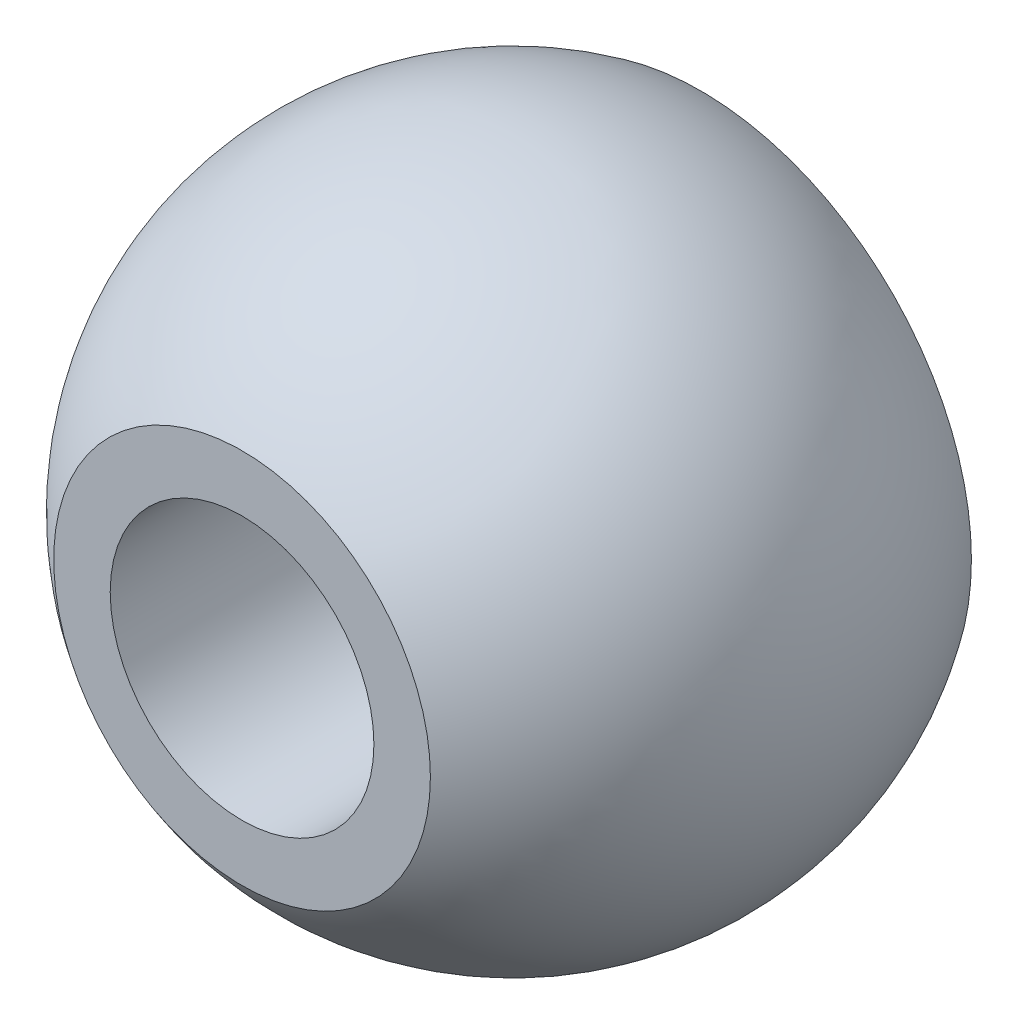
ISO-10303-21;
HEADER;
FILE_DESCRIPTION(('STEP AP214'),'2;1');
FILE_NAME('part.step','',(''),(''),'','','');
FILE_SCHEMA(('AUTOMOTIVE_DESIGN { 1 0 10303 214 1 1 1 1 }'));
ENDSEC;
DATA;
#1=APPLICATION_CONTEXT('core data for automotive mechanical design processes');
#2=APPLICATION_PROTOCOL_DEFINITION('international standard','automotive_design',2000,#1);
#3=PRODUCT_CONTEXT('',#1,'mechanical');
#4=PRODUCT('Part','Part','',(#3));
#5=PRODUCT_RELATED_PRODUCT_CATEGORY('part','',(#4));
#6=PRODUCT_DEFINITION_FORMATION('','',#4);
#7=PRODUCT_DEFINITION_CONTEXT('part definition',#1,'design');
#8=PRODUCT_DEFINITION('design','',#6,#7);
#9=PRODUCT_DEFINITION_SHAPE('','',#8);
#10=(LENGTH_UNIT() NAMED_UNIT(*) SI_UNIT(.MILLI.,.METRE.));
#11=(NAMED_UNIT(*) PLANE_ANGLE_UNIT() SI_UNIT($,.RADIAN.));
#12=(NAMED_UNIT(*) SI_UNIT($,.STERADIAN.) SOLID_ANGLE_UNIT());
#13=UNCERTAINTY_MEASURE_WITH_UNIT(LENGTH_MEASURE(1.E-05),#10,'distance_accuracy_value','');
#14=(GEOMETRIC_REPRESENTATION_CONTEXT(3) GLOBAL_UNCERTAINTY_ASSIGNED_CONTEXT((#13)) GLOBAL_UNIT_ASSIGNED_CONTEXT((#10,
#11,#12)) REPRESENTATION_CONTEXT('',''));
#15=CARTESIAN_POINT('',(0.,0.,0.));
#16=DIRECTION('',(0.,0.,1.));
#17=DIRECTION('',(1.,0.,0.));
#18=AXIS2_PLACEMENT_3D('',#15,#16,#17);
#19=CARTESIAN_POINT('',(84.,0.,3.));
#20=DIRECTION('',(0.,0.,1.));
#21=DIRECTION('',(1.,0.,0.));
#22=AXIS2_PLACEMENT_3D('',#19,#20,#21);
#23=SPHERICAL_SURFACE('',#22,5.25);
#24=CARTESIAN_POINT('',(84.,0.,0.));
#25=DIRECTION('',(0.,0.,1.));
#26=DIRECTION('',(1.,0.,0.));
#27=AXIS2_PLACEMENT_3D('',#24,#25,#26);
#28=CIRCLE('',#27,4.30842198490351);
#29=CARTESIAN_POINT('',(88.3084219849035,0.,0.));
#30=VERTEX_POINT('',#29);
#31=EDGE_CURVE('E10',#30,#30,#28,.T.);
#32=CARTESIAN_POINT('',(84.,0.,7.30842198490352));
#33=DIRECTION('',(0.,0.,1.));
#34=DIRECTION('',(1.,0.,0.));
#35=AXIS2_PLACEMENT_3D('',#32,#33,#34);
#36=CIRCLE('',#35,3.);
#37=CARTESIAN_POINT('',(87.,0.,7.30842198490352));
#38=VERTEX_POINT('',#37);
#39=EDGE_CURVE('E58',#38,#38,#36,.T.);
#40=CARTESIAN_POINT('',(88.3084219849035,0.,0.));
#41=CARTESIAN_POINT('',(88.3575109150911,0.,0.0704954198003969));
#42=CARTESIAN_POINT('',(88.4048665773806,0.,0.142197543513687));
#43=CARTESIAN_POINT('',(88.4960040724562,0.,0.287838212895942));
#44=CARTESIAN_POINT('',(88.5397859052424,0.,0.361776758564908));
#45=CARTESIAN_POINT('',(88.6236684476044,0.,0.511713285988413));
#46=CARTESIAN_POINT('',(88.6637691571803,0.,0.587711267742951));
#47=CARTESIAN_POINT('',(88.7401933345167,0.,0.74158327646597));
#48=CARTESIAN_POINT('',(88.7765168022772,0.,0.819457303434451));
#49=CARTESIAN_POINT('',(88.8452988589377,0.,0.976893878978552));
#50=CARTESIAN_POINT('',(88.8777574478377,0.,1.05645642755417));
#51=CARTESIAN_POINT('',(88.9387315861957,0.,1.21707835126063));
#52=CARTESIAN_POINT('',(88.9672471356536,0.,1.29813772639147));
#53=CARTESIAN_POINT('',(89.0202664892924,0.,1.46155802994277));
#54=CARTESIAN_POINT('',(89.0447702934732,0.,1.54391895836322));
#55=CARTESIAN_POINT('',(89.0897071272601,0.,1.70974395223059));
#56=CARTESIAN_POINT('',(89.1101401568662,0.,1.79320801767751));
#57=CARTESIAN_POINT('',(89.1468862158724,0.,1.96103821377495));
#58=CARTESIAN_POINT('',(89.1631992452724,0.,2.04540434442547));
#59=CARTESIAN_POINT('',(89.1916660045302,0.,2.21483542541887));
#60=CARTESIAN_POINT('',(89.2038197343879,0.,2.29990037576175));
#61=CARTESIAN_POINT('',(89.2239386151129,0.,2.47052416725393));
#62=CARTESIAN_POINT('',(89.2319037659801,0.,2.55608300840323));
#63=CARTESIAN_POINT('',(89.243626299991,0.,2.72748846275775));
#64=CARTESIAN_POINT('',(89.2473836831347,0.,2.81333507596297));
#65=CARTESIAN_POINT('',(89.2506816298299,0.,2.98510926242101));
#66=CARTESIAN_POINT('',(89.2502221933814,0.,3.07103683567383));
#67=CARTESIAN_POINT('',(89.2450876077158,0.,3.24276593517617));
#68=CARTESIAN_POINT('',(89.2404124584987,0.,3.32856746142568));
#69=CARTESIAN_POINT('',(89.2268577101397,0.,3.49983776352949));
#70=CARTESIAN_POINT('',(89.2179781109977,0.,3.58530653938378));
#71=CARTESIAN_POINT('',(89.196035854521,0.,3.75570543892991));
#72=CARTESIAN_POINT('',(89.1829731971863,0.,3.84063556262173));
#73=CARTESIAN_POINT('',(89.1526962934099,0.,4.00975255373595));
#74=CARTESIAN_POINT('',(89.1354820469681,0.,4.09393942115834));
#75=CARTESIAN_POINT('',(89.0969434356051,0.,4.26136708619617));
#76=CARTESIAN_POINT('',(89.0756190706837,0.,4.34460788381162));
#77=CARTESIAN_POINT('',(89.0289115946243,0.,4.50994287486301));
#78=CARTESIAN_POINT('',(89.0035284834862,0.,4.59203706829897));
#79=CARTESIAN_POINT('',(88.9487646651315,0.,4.75488107888902));
#80=CARTESIAN_POINT('',(88.9193839579149,0.,4.83563089604313));
#81=CARTESIAN_POINT('',(88.8566957280996,0.,4.99559162068624));
#82=CARTESIAN_POINT('',(88.8233882055009,0.,5.07480252817525));
#83=CARTESIAN_POINT('',(88.7529265856633,0.,5.23149460747723));
#84=CARTESIAN_POINT('',(88.7157724884244,0.,5.3089757792902));
#85=CARTESIAN_POINT('',(88.6377072267715,0.,5.46202172829854));
#86=CARTESIAN_POINT('',(88.5967960623576,0.,5.53758650549391));
#87=CARTESIAN_POINT('',(88.5113152249681,0.,5.68661762314526));
#88=CARTESIAN_POINT('',(88.4667455519924,0.,5.76008396360124));
#89=CARTESIAN_POINT('',(88.3740550695955,0.,5.90474122075625));
#90=CARTESIAN_POINT('',(88.3259342601742,0.,5.97593213745528));
#91=CARTESIAN_POINT('',(88.2262574326159,0.,6.11586704257132));
#92=CARTESIAN_POINT('',(88.174701414479,0.,6.18461103098831));
#93=CARTESIAN_POINT('',(88.0682783706417,0.,6.31948646690412));
#94=CARTESIAN_POINT('',(88.0134113449414,0.,6.38561791440293));
#95=CARTESIAN_POINT('',(87.9004984722079,0.,6.51510896079126));
#96=CARTESIAN_POINT('',(87.8424526251749,0.,6.57846855968079));
#97=CARTESIAN_POINT('',(87.7233219220769,0.,6.70226323734053));
#98=CARTESIAN_POINT('',(87.662237066012,0.,6.76269831611074));
#99=CARTESIAN_POINT('',(87.5371755977743,0.,6.88049848212188));
#100=CARTESIAN_POINT('',(87.4731989856017,0.,6.9378635693628));
#101=CARTESIAN_POINT('',(87.342507779018,0.,7.04938509952922));
#102=CARTESIAN_POINT('',(87.2757931846071,0.,7.10354154245472));
#103=CARTESIAN_POINT('',(87.1397880462646,0.,7.20851701545298));
#104=CARTESIAN_POINT('',(87.070497502333,0.,7.25933604552576));
#105=CARTESIAN_POINT('',(87.,0.,7.30842198490352));
#106=B_SPLINE_CURVE_WITH_KNOTS('',3,(#40,#41,#42,#43,#44,#45,#46,#47,#48,#49,#50,#51,#52,#53,
#54,#55,#56,#57,#58,#59,#60,#61,#62,#63,#64,#65,#66,#67,#68,#69,#70,#71,#72,#73,#74,#75,#76,#77,
#78,#79,#80,#81,#82,#83,#84,#85,#86,#87,#88,#89,#90,#91,#92,#93,#94,#95,#96,#97,#98,#99,#100,
#101,#102,#103,#104,#105),.UNSPECIFIED.,.F.,.F.,(4,2,2,2,2,2,2,2,2,2,2,2,2,2,2,2,2,2,2,2,2,2,2,
2,2,2,2,2,2,2,2,2,4),(0.,0.257682899490583,0.515365798981159,0.773048698471736,1.03073159796232,
1.2884144974529,1.54609739694348,1.80378029643405,2.06146319592463,2.31914609541521,
2.57682899490579,2.83451189439637,3.09219479388695,3.34987769337753,3.60756059286811,
3.86524349235869,4.12292639184927,4.38060929133985,4.63829219083043,4.895975090321,
5.15365798981158,5.41134088930216,5.66902378879274,5.92670668828332,6.1843895877739,
6.44207248726447,6.69975538675505,6.95743828624564,7.21512118573621,7.47280408522679,
7.73048698471737,7.98816988420795,8.24585278369853),.UNSPECIFIED.);
#107=EDGE_CURVE('BSEAM41',#30,#38,#106,.T.);
#108=ORIENTED_EDGE('',*,*,#31,.T.);
#109=ORIENTED_EDGE('',*,*,#39,.F.);
#110=ORIENTED_EDGE('',*,*,#107,.T.);
#111=ORIENTED_EDGE('',*,*,#107,.F.);
#112=EDGE_LOOP('',(#108,#110,#109,#111));
#113=FACE_BOUND('',#112,.T.);
#114=ADVANCED_FACE('F41',(#113),#23,.T.);
#115=CARTESIAN_POINT('',(88.3084219849035,0.,0.));
#116=DIRECTION('',(0.,0.,-1.));
#117=DIRECTION('',(-1.,0.,0.));
#118=AXIS2_PLACEMENT_3D('',#115,#116,#117);
#119=PLANE('',#118);
#120=CARTESIAN_POINT('',(84.,0.,0.));
#121=DIRECTION('',(0.,0.,1.));
#122=DIRECTION('',(1.,0.,0.));
#123=AXIS2_PLACEMENT_3D('',#120,#121,#122);
#124=CIRCLE('',#123,2.1);
#125=CARTESIAN_POINT('',(86.1,0.,0.));
#126=VERTEX_POINT('',#125);
#127=EDGE_CURVE('E48',#126,#126,#124,.T.);
#128=ORIENTED_EDGE('',*,*,#127,.T.);
#129=EDGE_LOOP('',(#128));
#130=FACE_BOUND('',#129,.T.);
#131=ORIENTED_EDGE('',*,*,#31,.F.);
#132=EDGE_LOOP('',(#131));
#133=FACE_BOUND('',#132,.T.);
#134=ADVANCED_FACE('F69',(#130,#133),#119,.T.);
#135=CARTESIAN_POINT('',(84.,0.,0.));
#136=DIRECTION('',(0.,0.,1.));
#137=DIRECTION('',(1.,0.,0.));
#138=AXIS2_PLACEMENT_3D('',#135,#136,#137);
#139=CYLINDRICAL_SURFACE('',#138,2.1);
#140=CARTESIAN_POINT('',(84.,0.,7.30842198490352));
#141=DIRECTION('',(0.,0.,1.));
#142=DIRECTION('',(1.,0.,0.));
#143=AXIS2_PLACEMENT_3D('',#140,#141,#142);
#144=CIRCLE('',#143,2.1);
#145=CARTESIAN_POINT('',(86.1,0.,7.30842198490352));
#146=VERTEX_POINT('',#145);
#147=EDGE_CURVE('E53',#146,#146,#144,.T.);
#148=ORIENTED_EDGE('',*,*,#147,.T.);
#149=EDGE_LOOP('',(#148));
#150=FACE_BOUND('',#149,.T.);
#151=ORIENTED_EDGE('',*,*,#127,.F.);
#152=EDGE_LOOP('',(#151));
#153=FACE_BOUND('',#152,.T.);
#154=ADVANCED_FACE('F73',(#150,#153),#139,.F.);
#155=CARTESIAN_POINT('',(86.1,0.,7.30842198490352));
#156=DIRECTION('',(0.,0.,1.));
#157=DIRECTION('',(1.,0.,0.));
#158=AXIS2_PLACEMENT_3D('',#155,#156,#157);
#159=PLANE('',#158);
#160=ORIENTED_EDGE('',*,*,#39,.T.);
#161=EDGE_LOOP('',(#160));
#162=FACE_BOUND('',#161,.T.);
#163=ORIENTED_EDGE('',*,*,#147,.F.);
#164=EDGE_LOOP('',(#163));
#165=FACE_BOUND('',#164,.T.);
#166=ADVANCED_FACE('F65',(#162,#165),#159,.T.);
#167=CLOSED_SHELL('',(#114,#134,#154,#166));
#168=MANIFOLD_SOLID_BREP('B2',#167);
#169=ADVANCED_BREP_SHAPE_REPRESENTATION('',(#18,#168),#14);
#170=SHAPE_DEFINITION_REPRESENTATION(#9,#169);
ENDSEC;
END-ISO-10303-21;
